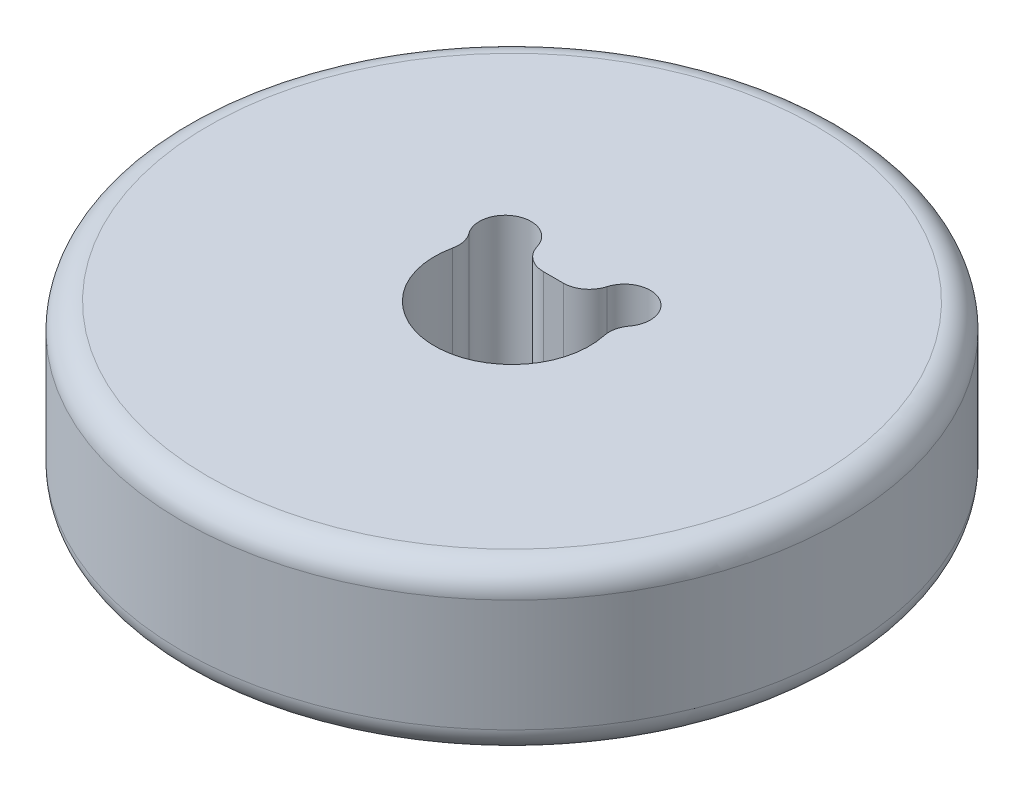
ISO-10303-21;
HEADER;
FILE_DESCRIPTION(('STEP AP214'),'2;1');
FILE_NAME('part.step','',(''),(''),'','','');
FILE_SCHEMA(('AUTOMOTIVE_DESIGN { 1 0 10303 214 1 1 1 1 }'));
ENDSEC;
DATA;
#1=APPLICATION_CONTEXT('core data for automotive mechanical design processes');
#2=APPLICATION_PROTOCOL_DEFINITION('international standard','automotive_design',2000,#1);
#3=PRODUCT_CONTEXT('',#1,'mechanical');
#4=PRODUCT('Part','Part','',(#3));
#5=PRODUCT_RELATED_PRODUCT_CATEGORY('part','',(#4));
#6=PRODUCT_DEFINITION_FORMATION('','',#4);
#7=PRODUCT_DEFINITION_CONTEXT('part definition',#1,'design');
#8=PRODUCT_DEFINITION('design','',#6,#7);
#9=PRODUCT_DEFINITION_SHAPE('','',#8);
#10=(LENGTH_UNIT() NAMED_UNIT(*) SI_UNIT(.MILLI.,.METRE.));
#11=(NAMED_UNIT(*) PLANE_ANGLE_UNIT() SI_UNIT($,.RADIAN.));
#12=(NAMED_UNIT(*) SI_UNIT($,.STERADIAN.) SOLID_ANGLE_UNIT());
#13=UNCERTAINTY_MEASURE_WITH_UNIT(LENGTH_MEASURE(1.E-05),#10,'distance_accuracy_value','');
#14=(GEOMETRIC_REPRESENTATION_CONTEXT(3) GLOBAL_UNCERTAINTY_ASSIGNED_CONTEXT((#13)) GLOBAL_UNIT_ASSIGNED_CONTEXT((#10,
#11,#12)) REPRESENTATION_CONTEXT('',''));
#15=CARTESIAN_POINT('',(0.,0.,0.));
#16=DIRECTION('',(0.,0.,1.));
#17=DIRECTION('',(1.,0.,0.));
#18=AXIS2_PLACEMENT_3D('',#15,#16,#17);
#19=CARTESIAN_POINT('',(0.,6.35,0.));
#20=DIRECTION('',(0.,1.,0.));
#21=DIRECTION('',(0.,0.,1.));
#22=AXIS2_PLACEMENT_3D('',#19,#20,#21);
#23=PLANE('',#22);
#24=CARTESIAN_POINT('',(0.,6.35,0.));
#25=DIRECTION('',(0.,1.,0.));
#26=DIRECTION('',(0.,0.,1.));
#27=AXIS2_PLACEMENT_3D('',#24,#25,#26);
#28=CIRCLE('',#27,11.75);
#29=CARTESIAN_POINT('',(0.,6.35,11.75));
#30=VERTEX_POINT('',#29);
#31=EDGE_CURVE('E184',#30,#30,#28,.T.);
#32=ORIENTED_EDGE('',*,*,#31,.T.);
#33=EDGE_LOOP('',(#32));
#34=FACE_BOUND('',#33,.T.);
#35=CARTESIAN_POINT('',(2.3072224291889,6.35,-2.04370366302154));
#36=DIRECTION('',(0.,1.,0.));
#37=DIRECTION('',(0.,0.,1.));
#38=AXIS2_PLACEMENT_3D('',#35,#36,#37);
#39=CIRCLE('',#38,1.);
#40=CARTESIAN_POINT('',(3.1083032204114,6.35,-1.44514742845846));
#41=VERTEX_POINT('',#40);
#42=CARTESIAN_POINT('',(1.34668424860153,6.35,-2.32185183151077));
#43=VERTEX_POINT('',#42);
#44=EDGE_CURVE('E133',#41,#43,#39,.T.);
#45=ORIENTED_EDGE('',*,*,#44,.F.);
#46=CARTESIAN_POINT('',(3.9093840116339,6.35,-0.846591193895386));
#47=DIRECTION('',(0.,1.,0.));
#48=DIRECTION('',(0.,0.,1.));
#49=AXIS2_PLACEMENT_3D('',#46,#47,#48);
#50=CIRCLE('',#49,1.);
#51=CARTESIAN_POINT('',(2.93203800872543,6.35,-0.634943395421539));
#52=VERTEX_POINT('',#51);
#53=EDGE_CURVE('E169',#41,#52,#50,.T.);
#54=ORIENTED_EDGE('',*,*,#53,.T.);
#55=CARTESIAN_POINT('',(0.,6.35,0.));
#56=DIRECTION('',(0.,1.,0.));
#57=DIRECTION('',(0.,0.,1.));
#58=AXIS2_PLACEMENT_3D('',#55,#56,#57);
#59=CIRCLE('',#58,3.);
#60=CARTESIAN_POINT('',(-2.93203800872543,6.35,-0.634943395421538));
#61=VERTEX_POINT('',#60);
#62=EDGE_CURVE('E137',#61,#52,#59,.T.);
#63=ORIENTED_EDGE('',*,*,#62,.F.);
#64=CARTESIAN_POINT('',(-3.9093840116339,6.35,-0.846591193895384));
#65=DIRECTION('',(0.,1.,0.));
#66=DIRECTION('',(0.,0.,1.));
#67=AXIS2_PLACEMENT_3D('',#64,#65,#66);
#68=CIRCLE('',#67,1.);
#69=CARTESIAN_POINT('',(-3.1083032204114,6.35,-1.44514742845846));
#70=VERTEX_POINT('',#69);
#71=EDGE_CURVE('E61',#61,#70,#68,.T.);
#72=ORIENTED_EDGE('',*,*,#71,.T.);
#73=CARTESIAN_POINT('',(-2.3072224291889,6.35,-2.04370366302154));
#74=DIRECTION('',(0.,1.,0.));
#75=DIRECTION('',(0.,0.,1.));
#76=AXIS2_PLACEMENT_3D('',#73,#74,#75);
#77=CIRCLE('',#76,1.);
#78=CARTESIAN_POINT('',(-1.34668424860153,6.35,-2.32185183151077));
#79=VERTEX_POINT('',#78);
#80=EDGE_CURVE('E142',#79,#70,#77,.T.);
#81=ORIENTED_EDGE('',*,*,#80,.F.);
#82=CARTESIAN_POINT('',(-0.386146068014167,6.35,-2.6));
#83=DIRECTION('',(0.,1.,0.));
#84=DIRECTION('',(0.,0.,1.));
#85=AXIS2_PLACEMENT_3D('',#82,#83,#84);
#86=CIRCLE('',#85,1.);
#87=CARTESIAN_POINT('',(-0.386146068014167,6.35,-1.6));
#88=VERTEX_POINT('',#87);
#89=EDGE_CURVE('E163',#79,#88,#86,.T.);
#90=ORIENTED_EDGE('',*,*,#89,.T.);
#91=DIRECTION('',(-1.,0.,0.));
#92=VECTOR('',#91,1.);
#93=CARTESIAN_POINT('',(1.41104886373338,6.35,-1.6));
#94=LINE('',#93,#92);
#95=CARTESIAN_POINT('',(0.386146068014167,6.35,-1.6));
#96=VERTEX_POINT('',#95);
#97=EDGE_CURVE('E213',#96,#88,#94,.T.);
#98=ORIENTED_EDGE('',*,*,#97,.F.);
#99=CARTESIAN_POINT('',(0.386146068014167,6.35,-2.6));
#100=DIRECTION('',(0.,1.,0.));
#101=DIRECTION('',(0.,0.,1.));
#102=AXIS2_PLACEMENT_3D('',#99,#100,#101);
#103=CIRCLE('',#102,1.);
#104=EDGE_CURVE('E166',#96,#43,#103,.T.);
#105=ORIENTED_EDGE('',*,*,#104,.T.);
#106=EDGE_LOOP('',(#45,#54,#63,#72,#81,#90,#98,#105));
#107=FACE_BOUND('',#106,.T.);
#108=ADVANCED_FACE('F45',(#34,#107),#23,.T.);
#109=CARTESIAN_POINT('',(0.,0.,0.));
#110=DIRECTION('',(0.,1.,0.));
#111=DIRECTION('',(0.,0.,1.));
#112=AXIS2_PLACEMENT_3D('',#109,#110,#111);
#113=PLANE('',#112);
#114=CARTESIAN_POINT('',(0.,0.,0.));
#115=DIRECTION('',(0.,1.,0.));
#116=DIRECTION('',(0.,0.,1.));
#117=AXIS2_PLACEMENT_3D('',#114,#115,#116);
#118=CIRCLE('',#117,11.75);
#119=CARTESIAN_POINT('',(0.,0.,11.75));
#120=VERTEX_POINT('',#119);
#121=EDGE_CURVE('E11',#120,#120,#118,.F.);
#122=ORIENTED_EDGE('',*,*,#121,.T.);
#123=EDGE_LOOP('',(#122));
#124=FACE_BOUND('',#123,.T.);
#125=CARTESIAN_POINT('',(0.,0.,0.));
#126=DIRECTION('',(0.,1.,0.));
#127=DIRECTION('',(0.,0.,1.));
#128=AXIS2_PLACEMENT_3D('',#125,#126,#127);
#129=CIRCLE('',#128,3.);
#130=CARTESIAN_POINT('',(-2.93203800872543,0.,-0.634943395421538));
#131=VERTEX_POINT('',#130);
#132=CARTESIAN_POINT('',(2.93203800872543,0.,-0.634943395421539));
#133=VERTEX_POINT('',#132);
#134=EDGE_CURVE('E116',#131,#133,#129,.T.);
#135=ORIENTED_EDGE('',*,*,#134,.T.);
#136=CARTESIAN_POINT('',(3.9093840116339,0.,-0.846591193895386));
#137=DIRECTION('',(0.,1.,0.));
#138=DIRECTION('',(0.,0.,1.));
#139=AXIS2_PLACEMENT_3D('',#136,#137,#138);
#140=CIRCLE('',#139,1.);
#141=CARTESIAN_POINT('',(3.1083032204114,0.,-1.44514742845846));
#142=VERTEX_POINT('',#141);
#143=EDGE_CURVE('E151',#133,#142,#140,.F.);
#144=ORIENTED_EDGE('',*,*,#143,.T.);
#145=CARTESIAN_POINT('',(2.3072224291889,0.,-2.04370366302154));
#146=DIRECTION('',(0.,1.,0.));
#147=DIRECTION('',(0.,0.,1.));
#148=AXIS2_PLACEMENT_3D('',#145,#146,#147);
#149=CIRCLE('',#148,1.);
#150=CARTESIAN_POINT('',(1.34668424860153,0.,-2.32185183151077));
#151=VERTEX_POINT('',#150);
#152=EDGE_CURVE('E220',#142,#151,#149,.T.);
#153=ORIENTED_EDGE('',*,*,#152,.T.);
#154=CARTESIAN_POINT('',(0.386146068014167,0.,-2.6));
#155=DIRECTION('',(0.,1.,0.));
#156=DIRECTION('',(0.,0.,1.));
#157=AXIS2_PLACEMENT_3D('',#154,#155,#156);
#158=CIRCLE('',#157,1.);
#159=CARTESIAN_POINT('',(0.386146068014167,0.,-1.6));
#160=VERTEX_POINT('',#159);
#161=EDGE_CURVE('E148',#151,#160,#158,.F.);
#162=ORIENTED_EDGE('',*,*,#161,.T.);
#163=DIRECTION('',(-1.,0.,0.));
#164=VECTOR('',#163,1.);
#165=CARTESIAN_POINT('',(1.41104886373338,0.,-1.6));
#166=LINE('',#165,#164);
#167=CARTESIAN_POINT('',(-0.386146068014167,0.,-1.6));
#168=VERTEX_POINT('',#167);
#169=EDGE_CURVE('E223',#160,#168,#166,.T.);
#170=ORIENTED_EDGE('',*,*,#169,.T.);
#171=CARTESIAN_POINT('',(-0.386146068014167,0.,-2.6));
#172=DIRECTION('',(0.,1.,0.));
#173=DIRECTION('',(0.,0.,1.));
#174=AXIS2_PLACEMENT_3D('',#171,#172,#173);
#175=CIRCLE('',#174,1.);
#176=CARTESIAN_POINT('',(-1.34668424860153,0.,-2.32185183151077));
#177=VERTEX_POINT('',#176);
#178=EDGE_CURVE('E123',#168,#177,#175,.F.);
#179=ORIENTED_EDGE('',*,*,#178,.T.);
#180=CARTESIAN_POINT('',(-2.3072224291889,0.,-2.04370366302154));
#181=DIRECTION('',(0.,1.,0.));
#182=DIRECTION('',(0.,0.,1.));
#183=AXIS2_PLACEMENT_3D('',#180,#181,#182);
#184=CIRCLE('',#183,1.);
#185=CARTESIAN_POINT('',(-3.1083032204114,0.,-1.44514742845846));
#186=VERTEX_POINT('',#185);
#187=EDGE_CURVE('E117',#177,#186,#184,.T.);
#188=ORIENTED_EDGE('',*,*,#187,.T.);
#189=CARTESIAN_POINT('',(-3.9093840116339,0.,-0.846591193895384));
#190=DIRECTION('',(0.,1.,0.));
#191=DIRECTION('',(0.,0.,1.));
#192=AXIS2_PLACEMENT_3D('',#189,#190,#191);
#193=CIRCLE('',#192,1.);
#194=EDGE_CURVE('E113',#186,#131,#193,.F.);
#195=ORIENTED_EDGE('',*,*,#194,.T.);
#196=EDGE_LOOP('',(#135,#144,#153,#162,#170,#179,#188,#195));
#197=FACE_BOUND('',#196,.T.);
#198=ADVANCED_FACE('F115',(#124,#197),#113,.F.);
#199=CARTESIAN_POINT('',(0.,6.35,0.));
#200=DIRECTION('',(0.,-1.,0.));
#201=DIRECTION('',(0.,0.,-1.));
#202=AXIS2_PLACEMENT_3D('',#199,#200,#201);
#203=CYLINDRICAL_SURFACE('',#202,12.75);
#204=CARTESIAN_POINT('',(0.,5.35,0.));
#205=DIRECTION('',(0.,1.,0.));
#206=DIRECTION('',(0.,0.,1.));
#207=AXIS2_PLACEMENT_3D('',#204,#205,#206);
#208=CIRCLE('',#207,12.75);
#209=CARTESIAN_POINT('',(0.,5.35,12.75));
#210=VERTEX_POINT('',#209);
#211=EDGE_CURVE('E54',#210,#210,#208,.F.);
#212=ORIENTED_EDGE('',*,*,#211,.T.);
#213=EDGE_LOOP('',(#212));
#214=FACE_BOUND('',#213,.T.);
#215=CARTESIAN_POINT('',(0.,1.,0.));
#216=DIRECTION('',(0.,1.,0.));
#217=DIRECTION('',(0.,0.,1.));
#218=AXIS2_PLACEMENT_3D('',#215,#216,#217);
#219=CIRCLE('',#218,12.75);
#220=CARTESIAN_POINT('',(0.,1.,12.75));
#221=VERTEX_POINT('',#220);
#222=EDGE_CURVE('E188',#221,#221,#219,.T.);
#223=ORIENTED_EDGE('',*,*,#222,.T.);
#224=EDGE_LOOP('',(#223));
#225=FACE_BOUND('',#224,.T.);
#226=ADVANCED_FACE('F195',(#214,#225),#203,.T.);
#227=CARTESIAN_POINT('',(2.3072224291889,6.35,-2.04370366302154));
#228=DIRECTION('',(0.,-1.,0.));
#229=DIRECTION('',(0.,0.,-1.));
#230=AXIS2_PLACEMENT_3D('',#227,#228,#229);
#231=CYLINDRICAL_SURFACE('',#230,1.);
#232=ORIENTED_EDGE('',*,*,#152,.F.);
#233=DIRECTION('',(0.,-1.,0.));
#234=VECTOR('',#233,1.);
#235=CARTESIAN_POINT('',(3.1083032204114,6.35,-1.44514742845846));
#236=LINE('',#235,#234);
#237=EDGE_CURVE('E158',#142,#41,#236,.F.);
#238=ORIENTED_EDGE('',*,*,#237,.T.);
#239=ORIENTED_EDGE('',*,*,#44,.T.);
#240=DIRECTION('',(0.,-1.,0.));
#241=VECTOR('',#240,1.);
#242=CARTESIAN_POINT('',(1.34668424860153,6.35,-2.32185183151077));
#243=LINE('',#242,#241);
#244=EDGE_CURVE('E154',#43,#151,#243,.T.);
#245=ORIENTED_EDGE('',*,*,#244,.T.);
#246=EDGE_LOOP('',(#232,#238,#239,#245));
#247=FACE_BOUND('',#246,.T.);
#248=ADVANCED_FACE('F221',(#247),#231,.F.);
#249=CARTESIAN_POINT('',(1.41104886373338,6.35,-1.6));
#250=DIRECTION('',(0.,0.,1.));
#251=DIRECTION('',(1.,0.,0.));
#252=AXIS2_PLACEMENT_3D('',#249,#250,#251);
#253=PLANE('',#252);
#254=ORIENTED_EDGE('',*,*,#169,.F.);
#255=DIRECTION('',(0.,-1.,0.));
#256=VECTOR('',#255,1.);
#257=CARTESIAN_POINT('',(0.386146068014167,6.35,-1.6));
#258=LINE('',#257,#256);
#259=EDGE_CURVE('E176',#160,#96,#258,.F.);
#260=ORIENTED_EDGE('',*,*,#259,.T.);
#261=ORIENTED_EDGE('',*,*,#97,.T.);
#262=DIRECTION('',(0.,-1.,0.));
#263=VECTOR('',#262,1.);
#264=CARTESIAN_POINT('',(-0.386146068014167,6.35,-1.6));
#265=LINE('',#264,#263);
#266=EDGE_CURVE('E172',#88,#168,#265,.T.);
#267=ORIENTED_EDGE('',*,*,#266,.T.);
#268=EDGE_LOOP('',(#254,#260,#261,#267));
#269=FACE_BOUND('',#268,.T.);
#270=ADVANCED_FACE('F241',(#269),#253,.T.);
#271=CARTESIAN_POINT('',(-2.3072224291889,6.35,-2.04370366302154));
#272=DIRECTION('',(0.,-1.,0.));
#273=DIRECTION('',(0.,0.,-1.));
#274=AXIS2_PLACEMENT_3D('',#271,#272,#273);
#275=CYLINDRICAL_SURFACE('',#274,1.);
#276=ORIENTED_EDGE('',*,*,#187,.F.);
#277=DIRECTION('',(0.,-1.,0.));
#278=VECTOR('',#277,1.);
#279=CARTESIAN_POINT('',(-1.34668424860153,6.35,-2.32185183151077));
#280=LINE('',#279,#278);
#281=EDGE_CURVE('E68',#177,#79,#280,.F.);
#282=ORIENTED_EDGE('',*,*,#281,.T.);
#283=ORIENTED_EDGE('',*,*,#80,.T.);
#284=DIRECTION('',(0.,-1.,0.));
#285=VECTOR('',#284,1.);
#286=CARTESIAN_POINT('',(-3.1083032204114,6.35,-1.44514742845846));
#287=LINE('',#286,#285);
#288=EDGE_CURVE('E179',#70,#186,#287,.T.);
#289=ORIENTED_EDGE('',*,*,#288,.T.);
#290=EDGE_LOOP('',(#276,#282,#283,#289));
#291=FACE_BOUND('',#290,.T.);
#292=ADVANCED_FACE('F234',(#291),#275,.F.);
#293=CARTESIAN_POINT('',(0.,6.35,0.));
#294=DIRECTION('',(0.,-1.,0.));
#295=DIRECTION('',(0.,0.,-1.));
#296=AXIS2_PLACEMENT_3D('',#293,#294,#295);
#297=CYLINDRICAL_SURFACE('',#296,3.);
#298=ORIENTED_EDGE('',*,*,#62,.T.);
#299=DIRECTION('',(0.,-1.,0.));
#300=VECTOR('',#299,1.);
#301=CARTESIAN_POINT('',(2.93203800872543,6.35,-0.634943395421539));
#302=LINE('',#301,#300);
#303=EDGE_CURVE('E124',#52,#133,#302,.T.);
#304=ORIENTED_EDGE('',*,*,#303,.T.);
#305=ORIENTED_EDGE('',*,*,#134,.F.);
#306=DIRECTION('',(0.,-1.,0.));
#307=VECTOR('',#306,1.);
#308=CARTESIAN_POINT('',(-2.93203800872543,6.35,-0.634943395421538));
#309=LINE('',#308,#307);
#310=EDGE_CURVE('E130',#131,#61,#309,.F.);
#311=ORIENTED_EDGE('',*,*,#310,.T.);
#312=EDGE_LOOP('',(#298,#304,#305,#311));
#313=FACE_BOUND('',#312,.T.);
#314=ADVANCED_FACE('F129',(#313),#297,.F.);
#315=CARTESIAN_POINT('',(3.9093840116339,6.35,-0.846591193895386));
#316=DIRECTION('',(0.,-1.,0.));
#317=DIRECTION('',(0.,0.,-1.));
#318=AXIS2_PLACEMENT_3D('',#315,#316,#317);
#319=CYLINDRICAL_SURFACE('',#318,1.);
#320=ORIENTED_EDGE('',*,*,#53,.F.);
#321=ORIENTED_EDGE('',*,*,#237,.F.);
#322=ORIENTED_EDGE('',*,*,#143,.F.);
#323=ORIENTED_EDGE('',*,*,#303,.F.);
#324=EDGE_LOOP('',(#320,#321,#322,#323));
#325=FACE_BOUND('',#324,.T.);
#326=ADVANCED_FACE('F217',(#325),#319,.T.);
#327=CARTESIAN_POINT('',(0.386146068014167,6.35,-2.6));
#328=DIRECTION('',(0.,-1.,0.));
#329=DIRECTION('',(0.,0.,-1.));
#330=AXIS2_PLACEMENT_3D('',#327,#328,#329);
#331=CYLINDRICAL_SURFACE('',#330,1.);
#332=ORIENTED_EDGE('',*,*,#104,.F.);
#333=ORIENTED_EDGE('',*,*,#259,.F.);
#334=ORIENTED_EDGE('',*,*,#161,.F.);
#335=ORIENTED_EDGE('',*,*,#244,.F.);
#336=EDGE_LOOP('',(#332,#333,#334,#335));
#337=FACE_BOUND('',#336,.T.);
#338=ADVANCED_FACE('F244',(#337),#331,.T.);
#339=CARTESIAN_POINT('',(-0.386146068014167,6.35,-2.6));
#340=DIRECTION('',(0.,-1.,0.));
#341=DIRECTION('',(0.,0.,-1.));
#342=AXIS2_PLACEMENT_3D('',#339,#340,#341);
#343=CYLINDRICAL_SURFACE('',#342,1.);
#344=ORIENTED_EDGE('',*,*,#89,.F.);
#345=ORIENTED_EDGE('',*,*,#281,.F.);
#346=ORIENTED_EDGE('',*,*,#178,.F.);
#347=ORIENTED_EDGE('',*,*,#266,.F.);
#348=EDGE_LOOP('',(#344,#345,#346,#347));
#349=FACE_BOUND('',#348,.T.);
#350=ADVANCED_FACE('F238',(#349),#343,.T.);
#351=CARTESIAN_POINT('',(-3.9093840116339,6.35,-0.846591193895384));
#352=DIRECTION('',(0.,-1.,0.));
#353=DIRECTION('',(0.,0.,-1.));
#354=AXIS2_PLACEMENT_3D('',#351,#352,#353);
#355=CYLINDRICAL_SURFACE('',#354,1.);
#356=ORIENTED_EDGE('',*,*,#71,.F.);
#357=ORIENTED_EDGE('',*,*,#310,.F.);
#358=ORIENTED_EDGE('',*,*,#194,.F.);
#359=ORIENTED_EDGE('',*,*,#288,.F.);
#360=EDGE_LOOP('',(#356,#357,#358,#359));
#361=FACE_BOUND('',#360,.T.);
#362=ADVANCED_FACE('F135',(#361),#355,.T.);
#363=CARTESIAN_POINT('',(0.,5.35,0.));
#364=DIRECTION('',(0.,1.,0.));
#365=DIRECTION('',(0.,0.,1.));
#366=AXIS2_PLACEMENT_3D('',#363,#364,#365);
#367=TOROIDAL_SURFACE('',#366,11.75,1.);
#368=ORIENTED_EDGE('',*,*,#211,.F.);
#369=EDGE_LOOP('',(#368));
#370=FACE_BOUND('',#369,.T.);
#371=ORIENTED_EDGE('',*,*,#31,.F.);
#372=EDGE_LOOP('',(#371));
#373=FACE_BOUND('',#372,.T.);
#374=ADVANCED_FACE('F198',(#370,#373),#367,.T.);
#375=CARTESIAN_POINT('',(0.,1.,0.));
#376=DIRECTION('',(0.,1.,0.));
#377=DIRECTION('',(0.,0.,1.));
#378=AXIS2_PLACEMENT_3D('',#375,#376,#377);
#379=TOROIDAL_SURFACE('',#378,11.75,1.);
#380=ORIENTED_EDGE('',*,*,#121,.F.);
#381=EDGE_LOOP('',(#380));
#382=FACE_BOUND('',#381,.T.);
#383=ORIENTED_EDGE('',*,*,#222,.F.);
#384=EDGE_LOOP('',(#383));
#385=FACE_BOUND('',#384,.T.);
#386=ADVANCED_FACE('F47',(#382,#385),#379,.T.);
#387=CLOSED_SHELL('',(#108,#198,#226,#248,#270,#292,#314,#326,#338,#350,#362,#374,#386));
#388=MANIFOLD_SOLID_BREP('B2',#387);
#389=ADVANCED_BREP_SHAPE_REPRESENTATION('',(#18,#388),#14);
#390=SHAPE_DEFINITION_REPRESENTATION(#9,#389);
ENDSEC;
END-ISO-10303-21;
